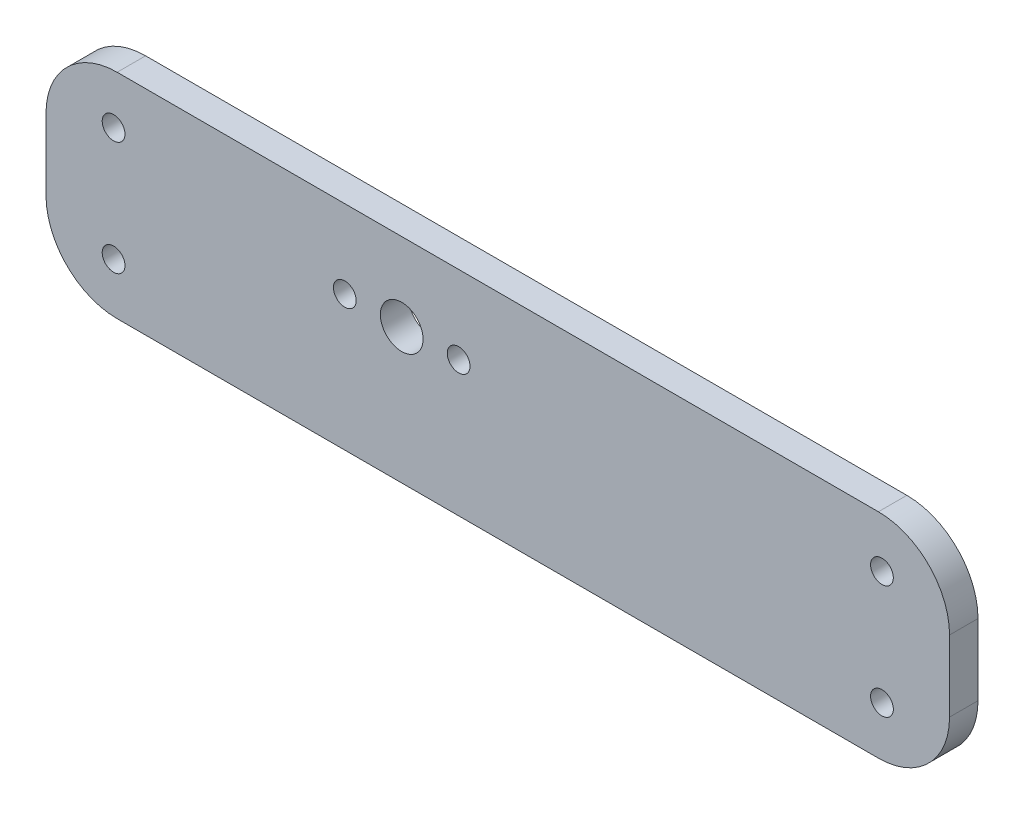
ISO-10303-21;
HEADER;
FILE_DESCRIPTION(('STEP AP214'),'2;1');
FILE_NAME('part.step','',(''),(''),'','','');
FILE_SCHEMA(('AUTOMOTIVE_DESIGN { 1 0 10303 214 1 1 1 1 }'));
ENDSEC;
DATA;
#1=APPLICATION_CONTEXT('core data for automotive mechanical design processes');
#2=APPLICATION_PROTOCOL_DEFINITION('international standard','automotive_design',2000,#1);
#3=PRODUCT_CONTEXT('',#1,'mechanical');
#4=PRODUCT('Part','Part','',(#3));
#5=PRODUCT_RELATED_PRODUCT_CATEGORY('part','',(#4));
#6=PRODUCT_DEFINITION_FORMATION('','',#4);
#7=PRODUCT_DEFINITION_CONTEXT('part definition',#1,'design');
#8=PRODUCT_DEFINITION('design','',#6,#7);
#9=PRODUCT_DEFINITION_SHAPE('','',#8);
#10=(LENGTH_UNIT() NAMED_UNIT(*) SI_UNIT(.MILLI.,.METRE.));
#11=(NAMED_UNIT(*) PLANE_ANGLE_UNIT() SI_UNIT($,.RADIAN.));
#12=(NAMED_UNIT(*) SI_UNIT($,.STERADIAN.) SOLID_ANGLE_UNIT());
#13=UNCERTAINTY_MEASURE_WITH_UNIT(LENGTH_MEASURE(1.E-05),#10,'distance_accuracy_value','');
#14=(GEOMETRIC_REPRESENTATION_CONTEXT(3) GLOBAL_UNCERTAINTY_ASSIGNED_CONTEXT((#13)) GLOBAL_UNIT_ASSIGNED_CONTEXT((#10,
#11,#12)) REPRESENTATION_CONTEXT('',''));
#15=CARTESIAN_POINT('',(0.,0.,0.));
#16=DIRECTION('',(0.,0.,1.));
#17=DIRECTION('',(1.,0.,0.));
#18=AXIS2_PLACEMENT_3D('',#15,#16,#17);
#19=CARTESIAN_POINT('',(0.,0.,4.));
#20=DIRECTION('',(0.,0.,-1.));
#21=DIRECTION('',(-1.,0.,0.));
#22=AXIS2_PLACEMENT_3D('',#19,#20,#21);
#23=PLANE('',#22);
#24=DIRECTION('',(-1.,0.,0.));
#25=VECTOR('',#24,1.);
#26=CARTESIAN_POINT('',(-63.5,15.,4.));
#27=LINE('',#26,#25);
#28=CARTESIAN_POINT('',(53.5,15.,4.));
#29=VERTEX_POINT('',#28);
#30=CARTESIAN_POINT('',(-53.5,15.,4.));
#31=VERTEX_POINT('',#30);
#32=EDGE_CURVE('E172',#29,#31,#27,.T.);
#33=ORIENTED_EDGE('',*,*,#32,.T.);
#34=CARTESIAN_POINT('',(-53.5,5.00000000000002,4.));
#35=DIRECTION('',(0.,0.,-1.));
#36=DIRECTION('',(-1.,0.,0.));
#37=AXIS2_PLACEMENT_3D('',#34,#35,#36);
#38=CIRCLE('',#37,10.);
#39=CARTESIAN_POINT('',(-63.5,5.00000000000002,4.));
#40=VERTEX_POINT('',#39);
#41=EDGE_CURVE('E153',#31,#40,#38,.F.);
#42=ORIENTED_EDGE('',*,*,#41,.T.);
#43=DIRECTION('',(0.,-1.,0.));
#44=VECTOR('',#43,1.);
#45=CARTESIAN_POINT('',(-63.5,-14.9999999999999,4.));
#46=LINE('',#45,#44);
#47=CARTESIAN_POINT('',(-63.5,-4.99999999999994,4.));
#48=VERTEX_POINT('',#47);
#49=EDGE_CURVE('E123',#40,#48,#46,.T.);
#50=ORIENTED_EDGE('',*,*,#49,.T.);
#51=CARTESIAN_POINT('',(-53.5,-4.99999999999994,4.));
#52=DIRECTION('',(0.,0.,-1.));
#53=DIRECTION('',(-1.,0.,0.));
#54=AXIS2_PLACEMENT_3D('',#51,#52,#53);
#55=CIRCLE('',#54,10.);
#56=CARTESIAN_POINT('',(-53.5,-14.9999999999999,4.));
#57=VERTEX_POINT('',#56);
#58=EDGE_CURVE('E59',#48,#57,#55,.F.);
#59=ORIENTED_EDGE('',*,*,#58,.T.);
#60=DIRECTION('',(1.,0.,0.));
#61=VECTOR('',#60,1.);
#62=CARTESIAN_POINT('',(-63.5,-14.9999999999999,4.));
#63=LINE('',#62,#61);
#64=CARTESIAN_POINT('',(53.5,-15.,4.));
#65=VERTEX_POINT('',#64);
#66=EDGE_CURVE('E139',#57,#65,#63,.T.);
#67=ORIENTED_EDGE('',*,*,#66,.T.);
#68=CARTESIAN_POINT('',(53.5,-4.99999999999999,4.));
#69=DIRECTION('',(0.,0.,-1.));
#70=DIRECTION('',(-1.,0.,0.));
#71=AXIS2_PLACEMENT_3D('',#68,#69,#70);
#72=CIRCLE('',#71,10.);
#73=CARTESIAN_POINT('',(63.5,-4.99999999999999,4.));
#74=VERTEX_POINT('',#73);
#75=EDGE_CURVE('E150',#65,#74,#72,.F.);
#76=ORIENTED_EDGE('',*,*,#75,.T.);
#77=DIRECTION('',(0.,1.,0.));
#78=VECTOR('',#77,1.);
#79=CARTESIAN_POINT('',(63.5,-15.,4.));
#80=LINE('',#79,#78);
#81=CARTESIAN_POINT('',(63.5,5.00000000000001,4.));
#82=VERTEX_POINT('',#81);
#83=EDGE_CURVE('E133',#74,#82,#80,.T.);
#84=ORIENTED_EDGE('',*,*,#83,.T.);
#85=CARTESIAN_POINT('',(53.5,5.00000000000001,4.));
#86=DIRECTION('',(0.,0.,-1.));
#87=DIRECTION('',(-1.,0.,0.));
#88=AXIS2_PLACEMENT_3D('',#85,#86,#87);
#89=CIRCLE('',#88,10.);
#90=EDGE_CURVE('E148',#82,#29,#89,.F.);
#91=ORIENTED_EDGE('',*,*,#90,.T.);
#92=EDGE_LOOP('',(#33,#42,#50,#59,#67,#76,#84,#91));
#93=FACE_BOUND('',#92,.T.);
#94=CARTESIAN_POINT('',(-13.5,4.,4.));
#95=DIRECTION('',(0.,0.,1.));
#96=DIRECTION('',(1.,0.,0.));
#97=AXIS2_PLACEMENT_3D('',#94,#95,#96);
#98=CIRCLE('',#97,3.);
#99=CARTESIAN_POINT('',(-10.5,4.,4.));
#100=VERTEX_POINT('',#99);
#101=EDGE_CURVE('E177',#100,#100,#98,.T.);
#102=ORIENTED_EDGE('',*,*,#101,.F.);
#103=EDGE_LOOP('',(#102));
#104=FACE_BOUND('',#103,.T.);
#105=CARTESIAN_POINT('',(-5.49999999999999,4.,4.));
#106=DIRECTION('',(0.,0.,1.));
#107=DIRECTION('',(1.,0.,0.));
#108=AXIS2_PLACEMENT_3D('',#105,#106,#107);
#109=CIRCLE('',#108,1.6);
#110=CARTESIAN_POINT('',(-3.89999999999999,4.,4.));
#111=VERTEX_POINT('',#110);
#112=EDGE_CURVE('E186',#111,#111,#109,.T.);
#113=ORIENTED_EDGE('',*,*,#112,.F.);
#114=EDGE_LOOP('',(#113));
#115=FACE_BOUND('',#114,.T.);
#116=CARTESIAN_POINT('',(-21.5,4.,4.));
#117=DIRECTION('',(0.,0.,1.));
#118=DIRECTION('',(1.,0.,0.));
#119=AXIS2_PLACEMENT_3D('',#116,#117,#118);
#120=CIRCLE('',#119,1.6);
#121=CARTESIAN_POINT('',(-19.9,4.,4.));
#122=VERTEX_POINT('',#121);
#123=EDGE_CURVE('E191',#122,#122,#120,.T.);
#124=ORIENTED_EDGE('',*,*,#123,.F.);
#125=EDGE_LOOP('',(#124));
#126=FACE_BOUND('',#125,.T.);
#127=CARTESIAN_POINT('',(-54.,-8.,4.));
#128=DIRECTION('',(0.,0.,1.));
#129=DIRECTION('',(-1.,0.,0.));
#130=AXIS2_PLACEMENT_3D('',#127,#128,#129);
#131=CIRCLE('',#130,1.6);
#132=CARTESIAN_POINT('',(-55.6,-8.,4.));
#133=VERTEX_POINT('',#132);
#134=EDGE_CURVE('E197',#133,#133,#131,.T.);
#135=ORIENTED_EDGE('',*,*,#134,.F.);
#136=EDGE_LOOP('',(#135));
#137=FACE_BOUND('',#136,.T.);
#138=CARTESIAN_POINT('',(-54.,8.,4.));
#139=DIRECTION('',(0.,0.,1.));
#140=DIRECTION('',(1.,0.,0.));
#141=AXIS2_PLACEMENT_3D('',#138,#139,#140);
#142=CIRCLE('',#141,1.6);
#143=CARTESIAN_POINT('',(-52.4,8.,4.));
#144=VERTEX_POINT('',#143);
#145=EDGE_CURVE('E203',#144,#144,#142,.T.);
#146=ORIENTED_EDGE('',*,*,#145,.F.);
#147=EDGE_LOOP('',(#146));
#148=FACE_BOUND('',#147,.T.);
#149=CARTESIAN_POINT('',(54.,-7.99999999999999,4.));
#150=DIRECTION('',(0.,0.,1.));
#151=DIRECTION('',(1.,0.,0.));
#152=AXIS2_PLACEMENT_3D('',#149,#150,#151);
#153=CIRCLE('',#152,1.6);
#154=CARTESIAN_POINT('',(55.6,-7.99999999999999,4.));
#155=VERTEX_POINT('',#154);
#156=EDGE_CURVE('E209',#155,#155,#153,.T.);
#157=ORIENTED_EDGE('',*,*,#156,.F.);
#158=EDGE_LOOP('',(#157));
#159=FACE_BOUND('',#158,.T.);
#160=CARTESIAN_POINT('',(54.,8.00000000000001,4.));
#161=DIRECTION('',(0.,0.,1.));
#162=DIRECTION('',(-1.,0.,0.));
#163=AXIS2_PLACEMENT_3D('',#160,#161,#162);
#164=CIRCLE('',#163,1.6);
#165=CARTESIAN_POINT('',(52.4,8.00000000000001,4.));
#166=VERTEX_POINT('',#165);
#167=EDGE_CURVE('E215',#166,#166,#164,.T.);
#168=ORIENTED_EDGE('',*,*,#167,.F.);
#169=EDGE_LOOP('',(#168));
#170=FACE_BOUND('',#169,.T.);
#171=ADVANCED_FACE('F37',(#93,#104,#115,#126,#137,#148,#159,#170),#23,.F.);
#172=CARTESIAN_POINT('',(0.,0.,0.));
#173=DIRECTION('',(0.,0.,-1.));
#174=DIRECTION('',(-1.,0.,0.));
#175=AXIS2_PLACEMENT_3D('',#172,#173,#174);
#176=PLANE('',#175);
#177=CARTESIAN_POINT('',(54.,-7.99999999999999,0.));
#178=DIRECTION('',(0.,0.,1.));
#179=DIRECTION('',(1.,0.,0.));
#180=AXIS2_PLACEMENT_3D('',#177,#178,#179);
#181=CIRCLE('',#180,1.6);
#182=CARTESIAN_POINT('',(55.6,-7.99999999999999,0.));
#183=VERTEX_POINT('',#182);
#184=EDGE_CURVE('E212',#183,#183,#181,.T.);
#185=ORIENTED_EDGE('',*,*,#184,.T.);
#186=EDGE_LOOP('',(#185));
#187=FACE_BOUND('',#186,.T.);
#188=CARTESIAN_POINT('',(-54.,-8.,0.));
#189=DIRECTION('',(0.,0.,1.));
#190=DIRECTION('',(-1.,0.,0.));
#191=AXIS2_PLACEMENT_3D('',#188,#189,#190);
#192=CIRCLE('',#191,1.6);
#193=CARTESIAN_POINT('',(-55.6,-8.,0.));
#194=VERTEX_POINT('',#193);
#195=EDGE_CURVE('E200',#194,#194,#192,.T.);
#196=ORIENTED_EDGE('',*,*,#195,.T.);
#197=EDGE_LOOP('',(#196));
#198=FACE_BOUND('',#197,.T.);
#199=CARTESIAN_POINT('',(-5.49999999999999,4.,0.));
#200=DIRECTION('',(0.,0.,1.));
#201=DIRECTION('',(1.,0.,0.));
#202=AXIS2_PLACEMENT_3D('',#199,#200,#201);
#203=CIRCLE('',#202,1.6);
#204=CARTESIAN_POINT('',(-3.89999999999999,4.,0.));
#205=VERTEX_POINT('',#204);
#206=EDGE_CURVE('E188',#205,#205,#203,.T.);
#207=ORIENTED_EDGE('',*,*,#206,.T.);
#208=EDGE_LOOP('',(#207));
#209=FACE_BOUND('',#208,.T.);
#210=DIRECTION('',(0.,-1.,0.));
#211=VECTOR('',#210,1.);
#212=CARTESIAN_POINT('',(-63.5,-14.9999999999999,0.));
#213=LINE('',#212,#211);
#214=CARTESIAN_POINT('',(-63.5,5.00000000000002,0.));
#215=VERTEX_POINT('',#214);
#216=CARTESIAN_POINT('',(-63.5,-4.99999999999994,0.));
#217=VERTEX_POINT('',#216);
#218=EDGE_CURVE('E121',#215,#217,#213,.T.);
#219=ORIENTED_EDGE('',*,*,#218,.F.);
#220=CARTESIAN_POINT('',(-53.5,5.00000000000002,0.));
#221=DIRECTION('',(0.,0.,-1.));
#222=DIRECTION('',(-1.,0.,0.));
#223=AXIS2_PLACEMENT_3D('',#220,#221,#222);
#224=CIRCLE('',#223,10.);
#225=CARTESIAN_POINT('',(-53.5,15.,0.));
#226=VERTEX_POINT('',#225);
#227=EDGE_CURVE('E104',#215,#226,#224,.T.);
#228=ORIENTED_EDGE('',*,*,#227,.T.);
#229=DIRECTION('',(-1.,0.,0.));
#230=VECTOR('',#229,1.);
#231=CARTESIAN_POINT('',(-63.5,15.,0.));
#232=LINE('',#231,#230);
#233=CARTESIAN_POINT('',(53.5,15.,0.));
#234=VERTEX_POINT('',#233);
#235=EDGE_CURVE('E131',#234,#226,#232,.T.);
#236=ORIENTED_EDGE('',*,*,#235,.F.);
#237=CARTESIAN_POINT('',(53.5,5.00000000000001,0.));
#238=DIRECTION('',(0.,0.,-1.));
#239=DIRECTION('',(-1.,0.,0.));
#240=AXIS2_PLACEMENT_3D('',#237,#238,#239);
#241=CIRCLE('',#240,10.);
#242=CARTESIAN_POINT('',(63.5,5.00000000000001,0.));
#243=VERTEX_POINT('',#242);
#244=EDGE_CURVE('E124',#234,#243,#241,.T.);
#245=ORIENTED_EDGE('',*,*,#244,.T.);
#246=DIRECTION('',(0.,1.,0.));
#247=VECTOR('',#246,1.);
#248=CARTESIAN_POINT('',(63.5,-15.,0.));
#249=LINE('',#248,#247);
#250=CARTESIAN_POINT('',(63.5,-4.99999999999999,0.));
#251=VERTEX_POINT('',#250);
#252=EDGE_CURVE('E135',#251,#243,#249,.T.);
#253=ORIENTED_EDGE('',*,*,#252,.F.);
#254=CARTESIAN_POINT('',(53.5,-4.99999999999999,0.));
#255=DIRECTION('',(0.,0.,-1.));
#256=DIRECTION('',(-1.,0.,0.));
#257=AXIS2_PLACEMENT_3D('',#254,#255,#256);
#258=CIRCLE('',#257,10.);
#259=CARTESIAN_POINT('',(53.5,-15.,0.));
#260=VERTEX_POINT('',#259);
#261=EDGE_CURVE('E142',#251,#260,#258,.T.);
#262=ORIENTED_EDGE('',*,*,#261,.T.);
#263=DIRECTION('',(1.,0.,0.));
#264=VECTOR('',#263,1.);
#265=CARTESIAN_POINT('',(-63.5,-14.9999999999999,0.));
#266=LINE('',#265,#264);
#267=CARTESIAN_POINT('',(-53.5,-14.9999999999999,0.));
#268=VERTEX_POINT('',#267);
#269=EDGE_CURVE('E130',#268,#260,#266,.T.);
#270=ORIENTED_EDGE('',*,*,#269,.F.);
#271=CARTESIAN_POINT('',(-53.5,-4.99999999999994,0.));
#272=DIRECTION('',(0.,0.,-1.));
#273=DIRECTION('',(-1.,0.,0.));
#274=AXIS2_PLACEMENT_3D('',#271,#272,#273);
#275=CIRCLE('',#274,10.);
#276=EDGE_CURVE('E115',#268,#217,#275,.T.);
#277=ORIENTED_EDGE('',*,*,#276,.T.);
#278=EDGE_LOOP('',(#219,#228,#236,#245,#253,#262,#270,#277));
#279=FACE_BOUND('',#278,.T.);
#280=CARTESIAN_POINT('',(-13.5,4.,0.));
#281=DIRECTION('',(0.,0.,1.));
#282=DIRECTION('',(1.,0.,0.));
#283=AXIS2_PLACEMENT_3D('',#280,#281,#282);
#284=CIRCLE('',#283,3.);
#285=CARTESIAN_POINT('',(-10.5,4.,0.));
#286=VERTEX_POINT('',#285);
#287=EDGE_CURVE('E179',#286,#286,#284,.T.);
#288=ORIENTED_EDGE('',*,*,#287,.T.);
#289=EDGE_LOOP('',(#288));
#290=FACE_BOUND('',#289,.T.);
#291=CARTESIAN_POINT('',(-21.5,4.,0.));
#292=DIRECTION('',(0.,0.,1.));
#293=DIRECTION('',(1.,0.,0.));
#294=AXIS2_PLACEMENT_3D('',#291,#292,#293);
#295=CIRCLE('',#294,1.6);
#296=CARTESIAN_POINT('',(-19.9,4.,0.));
#297=VERTEX_POINT('',#296);
#298=EDGE_CURVE('E194',#297,#297,#295,.T.);
#299=ORIENTED_EDGE('',*,*,#298,.T.);
#300=EDGE_LOOP('',(#299));
#301=FACE_BOUND('',#300,.T.);
#302=CARTESIAN_POINT('',(-54.,8.,0.));
#303=DIRECTION('',(0.,0.,1.));
#304=DIRECTION('',(1.,0.,0.));
#305=AXIS2_PLACEMENT_3D('',#302,#303,#304);
#306=CIRCLE('',#305,1.6);
#307=CARTESIAN_POINT('',(-52.4,8.,0.));
#308=VERTEX_POINT('',#307);
#309=EDGE_CURVE('E206',#308,#308,#306,.T.);
#310=ORIENTED_EDGE('',*,*,#309,.T.);
#311=EDGE_LOOP('',(#310));
#312=FACE_BOUND('',#311,.T.);
#313=CARTESIAN_POINT('',(54.,8.00000000000001,0.));
#314=DIRECTION('',(0.,0.,1.));
#315=DIRECTION('',(-1.,0.,0.));
#316=AXIS2_PLACEMENT_3D('',#313,#314,#315);
#317=CIRCLE('',#316,1.6);
#318=CARTESIAN_POINT('',(52.4,8.00000000000001,0.));
#319=VERTEX_POINT('',#318);
#320=EDGE_CURVE('E218',#319,#319,#317,.T.);
#321=ORIENTED_EDGE('',*,*,#320,.T.);
#322=EDGE_LOOP('',(#321));
#323=FACE_BOUND('',#322,.T.);
#324=ADVANCED_FACE('F127',(#187,#198,#209,#279,#290,#301,#312,#323),#176,.T.);
#325=CARTESIAN_POINT('',(63.5,-15.,4.));
#326=DIRECTION('',(-1.,0.,0.));
#327=DIRECTION('',(0.,-1.,0.));
#328=AXIS2_PLACEMENT_3D('',#325,#326,#327);
#329=PLANE('',#328);
#330=ORIENTED_EDGE('',*,*,#83,.F.);
#331=DIRECTION('',(0.,0.,-1.));
#332=VECTOR('',#331,1.);
#333=CARTESIAN_POINT('',(63.5,-4.99999999999999,4.));
#334=LINE('',#333,#332);
#335=EDGE_CURVE('E11',#74,#251,#334,.T.);
#336=ORIENTED_EDGE('',*,*,#335,.T.);
#337=ORIENTED_EDGE('',*,*,#252,.T.);
#338=DIRECTION('',(0.,0.,-1.));
#339=VECTOR('',#338,1.);
#340=CARTESIAN_POINT('',(63.5,5.00000000000001,4.));
#341=LINE('',#340,#339);
#342=EDGE_CURVE('E45',#243,#82,#341,.F.);
#343=ORIENTED_EDGE('',*,*,#342,.T.);
#344=EDGE_LOOP('',(#330,#336,#337,#343));
#345=FACE_BOUND('',#344,.T.);
#346=ADVANCED_FACE('F163',(#345),#329,.F.);
#347=CARTESIAN_POINT('',(-63.5,15.,4.));
#348=DIRECTION('',(0.,-1.,0.));
#349=DIRECTION('',(1.,0.,0.));
#350=AXIS2_PLACEMENT_3D('',#347,#348,#349);
#351=PLANE('',#350);
#352=ORIENTED_EDGE('',*,*,#235,.T.);
#353=DIRECTION('',(0.,0.,-1.));
#354=VECTOR('',#353,1.);
#355=CARTESIAN_POINT('',(-53.5,15.,4.));
#356=LINE('',#355,#354);
#357=EDGE_CURVE('E109',#226,#31,#356,.F.);
#358=ORIENTED_EDGE('',*,*,#357,.T.);
#359=ORIENTED_EDGE('',*,*,#32,.F.);
#360=DIRECTION('',(0.,0.,-1.));
#361=VECTOR('',#360,1.);
#362=CARTESIAN_POINT('',(53.5,15.,4.));
#363=LINE('',#362,#361);
#364=EDGE_CURVE('E114',#29,#234,#363,.T.);
#365=ORIENTED_EDGE('',*,*,#364,.T.);
#366=EDGE_LOOP('',(#352,#358,#359,#365));
#367=FACE_BOUND('',#366,.T.);
#368=ADVANCED_FACE('F176',(#367),#351,.F.);
#369=CARTESIAN_POINT('',(-63.5,-14.9999999999999,4.));
#370=DIRECTION('',(1.,0.,0.));
#371=DIRECTION('',(0.,0.,-1.));
#372=AXIS2_PLACEMENT_3D('',#369,#370,#371);
#373=PLANE('',#372);
#374=ORIENTED_EDGE('',*,*,#49,.F.);
#375=DIRECTION('',(0.,0.,-1.));
#376=VECTOR('',#375,1.);
#377=CARTESIAN_POINT('',(-63.5,5.00000000000002,4.));
#378=LINE('',#377,#376);
#379=EDGE_CURVE('E108',#40,#215,#378,.T.);
#380=ORIENTED_EDGE('',*,*,#379,.T.);
#381=ORIENTED_EDGE('',*,*,#218,.T.);
#382=DIRECTION('',(0.,0.,-1.));
#383=VECTOR('',#382,1.);
#384=CARTESIAN_POINT('',(-63.5,-4.99999999999994,4.));
#385=LINE('',#384,#383);
#386=EDGE_CURVE('E125',#217,#48,#385,.F.);
#387=ORIENTED_EDGE('',*,*,#386,.T.);
#388=EDGE_LOOP('',(#374,#380,#381,#387));
#389=FACE_BOUND('',#388,.T.);
#390=ADVANCED_FACE('F120',(#389),#373,.F.);
#391=CARTESIAN_POINT('',(-63.5,-14.9999999999999,4.));
#392=DIRECTION('',(0.,1.,0.));
#393=DIRECTION('',(-1.,0.,0.));
#394=AXIS2_PLACEMENT_3D('',#391,#392,#393);
#395=PLANE('',#394);
#396=ORIENTED_EDGE('',*,*,#66,.F.);
#397=DIRECTION('',(0.,0.,-1.));
#398=VECTOR('',#397,1.);
#399=CARTESIAN_POINT('',(-53.5,-14.9999999999999,4.));
#400=LINE('',#399,#398);
#401=EDGE_CURVE('E156',#57,#268,#400,.T.);
#402=ORIENTED_EDGE('',*,*,#401,.T.);
#403=ORIENTED_EDGE('',*,*,#269,.T.);
#404=DIRECTION('',(0.,0.,-1.));
#405=VECTOR('',#404,1.);
#406=CARTESIAN_POINT('',(53.5,-15.,4.));
#407=LINE('',#406,#405);
#408=EDGE_CURVE('E52',#260,#65,#407,.F.);
#409=ORIENTED_EDGE('',*,*,#408,.T.);
#410=EDGE_LOOP('',(#396,#402,#403,#409));
#411=FACE_BOUND('',#410,.T.);
#412=ADVANCED_FACE('F238',(#411),#395,.F.);
#413=CARTESIAN_POINT('',(-13.5,4.,4.));
#414=DIRECTION('',(0.,0.,-1.));
#415=DIRECTION('',(-1.,0.,0.));
#416=AXIS2_PLACEMENT_3D('',#413,#414,#415);
#417=CYLINDRICAL_SURFACE('',#416,3.);
#418=ORIENTED_EDGE('',*,*,#101,.T.);
#419=EDGE_LOOP('',(#418));
#420=FACE_BOUND('',#419,.T.);
#421=ORIENTED_EDGE('',*,*,#287,.F.);
#422=EDGE_LOOP('',(#421));
#423=FACE_BOUND('',#422,.T.);
#424=ADVANCED_FACE('F235',(#420,#423),#417,.F.);
#425=CARTESIAN_POINT('',(-5.49999999999999,4.,4.));
#426=DIRECTION('',(0.,0.,-1.));
#427=DIRECTION('',(-1.,0.,0.));
#428=AXIS2_PLACEMENT_3D('',#425,#426,#427);
#429=CYLINDRICAL_SURFACE('',#428,1.6);
#430=ORIENTED_EDGE('',*,*,#112,.T.);
#431=EDGE_LOOP('',(#430));
#432=FACE_BOUND('',#431,.T.);
#433=ORIENTED_EDGE('',*,*,#206,.F.);
#434=EDGE_LOOP('',(#433));
#435=FACE_BOUND('',#434,.T.);
#436=ADVANCED_FACE('F360',(#432,#435),#429,.F.);
#437=CARTESIAN_POINT('',(-21.5,4.,4.));
#438=DIRECTION('',(0.,0.,-1.));
#439=DIRECTION('',(-1.,0.,0.));
#440=AXIS2_PLACEMENT_3D('',#437,#438,#439);
#441=CYLINDRICAL_SURFACE('',#440,1.6);
#442=ORIENTED_EDGE('',*,*,#123,.T.);
#443=EDGE_LOOP('',(#442));
#444=FACE_BOUND('',#443,.T.);
#445=ORIENTED_EDGE('',*,*,#298,.F.);
#446=EDGE_LOOP('',(#445));
#447=FACE_BOUND('',#446,.T.);
#448=ADVANCED_FACE('F350',(#444,#447),#441,.F.);
#449=CARTESIAN_POINT('',(-54.,-8.,4.));
#450=DIRECTION('',(0.,0.,-1.));
#451=DIRECTION('',(-1.,0.,0.));
#452=AXIS2_PLACEMENT_3D('',#449,#450,#451);
#453=CYLINDRICAL_SURFACE('',#452,1.6);
#454=ORIENTED_EDGE('',*,*,#134,.T.);
#455=EDGE_LOOP('',(#454));
#456=FACE_BOUND('',#455,.T.);
#457=ORIENTED_EDGE('',*,*,#195,.F.);
#458=EDGE_LOOP('',(#457));
#459=FACE_BOUND('',#458,.T.);
#460=ADVANCED_FACE('F340',(#456,#459),#453,.F.);
#461=CARTESIAN_POINT('',(-54.,8.,4.));
#462=DIRECTION('',(0.,0.,-1.));
#463=DIRECTION('',(-1.,0.,0.));
#464=AXIS2_PLACEMENT_3D('',#461,#462,#463);
#465=CYLINDRICAL_SURFACE('',#464,1.6);
#466=ORIENTED_EDGE('',*,*,#145,.T.);
#467=EDGE_LOOP('',(#466));
#468=FACE_BOUND('',#467,.T.);
#469=ORIENTED_EDGE('',*,*,#309,.F.);
#470=EDGE_LOOP('',(#469));
#471=FACE_BOUND('',#470,.T.);
#472=ADVANCED_FACE('F330',(#468,#471),#465,.F.);
#473=CARTESIAN_POINT('',(54.,-7.99999999999999,4.));
#474=DIRECTION('',(0.,0.,-1.));
#475=DIRECTION('',(-1.,0.,0.));
#476=AXIS2_PLACEMENT_3D('',#473,#474,#475);
#477=CYLINDRICAL_SURFACE('',#476,1.6);
#478=ORIENTED_EDGE('',*,*,#156,.T.);
#479=EDGE_LOOP('',(#478));
#480=FACE_BOUND('',#479,.T.);
#481=ORIENTED_EDGE('',*,*,#184,.F.);
#482=EDGE_LOOP('',(#481));
#483=FACE_BOUND('',#482,.T.);
#484=ADVANCED_FACE('F321',(#480,#483),#477,.F.);
#485=CARTESIAN_POINT('',(54.,8.00000000000001,4.));
#486=DIRECTION('',(0.,0.,-1.));
#487=DIRECTION('',(-1.,0.,0.));
#488=AXIS2_PLACEMENT_3D('',#485,#486,#487);
#489=CYLINDRICAL_SURFACE('',#488,1.6);
#490=ORIENTED_EDGE('',*,*,#167,.T.);
#491=EDGE_LOOP('',(#490));
#492=FACE_BOUND('',#491,.T.);
#493=ORIENTED_EDGE('',*,*,#320,.F.);
#494=EDGE_LOOP('',(#493));
#495=FACE_BOUND('',#494,.T.);
#496=ADVANCED_FACE('F224',(#492,#495),#489,.F.);
#497=CARTESIAN_POINT('',(-53.5,5.00000000000002,4.));
#498=DIRECTION('',(0.,0.,-1.));
#499=DIRECTION('',(-1.,0.,0.));
#500=AXIS2_PLACEMENT_3D('',#497,#498,#499);
#501=CYLINDRICAL_SURFACE('',#500,10.);
#502=ORIENTED_EDGE('',*,*,#41,.F.);
#503=ORIENTED_EDGE('',*,*,#357,.F.);
#504=ORIENTED_EDGE('',*,*,#227,.F.);
#505=ORIENTED_EDGE('',*,*,#379,.F.);
#506=EDGE_LOOP('',(#502,#503,#504,#505));
#507=FACE_BOUND('',#506,.T.);
#508=ADVANCED_FACE('F107',(#507),#501,.T.);
#509=CARTESIAN_POINT('',(-53.5,-4.99999999999994,4.));
#510=DIRECTION('',(0.,0.,-1.));
#511=DIRECTION('',(-1.,0.,0.));
#512=AXIS2_PLACEMENT_3D('',#509,#510,#511);
#513=CYLINDRICAL_SURFACE('',#512,10.);
#514=ORIENTED_EDGE('',*,*,#58,.F.);
#515=ORIENTED_EDGE('',*,*,#386,.F.);
#516=ORIENTED_EDGE('',*,*,#276,.F.);
#517=ORIENTED_EDGE('',*,*,#401,.F.);
#518=EDGE_LOOP('',(#514,#515,#516,#517));
#519=FACE_BOUND('',#518,.T.);
#520=ADVANCED_FACE('F249',(#519),#513,.T.);
#521=CARTESIAN_POINT('',(53.5,-4.99999999999999,4.));
#522=DIRECTION('',(0.,0.,-1.));
#523=DIRECTION('',(-1.,0.,0.));
#524=AXIS2_PLACEMENT_3D('',#521,#522,#523);
#525=CYLINDRICAL_SURFACE('',#524,10.);
#526=ORIENTED_EDGE('',*,*,#75,.F.);
#527=ORIENTED_EDGE('',*,*,#408,.F.);
#528=ORIENTED_EDGE('',*,*,#261,.F.);
#529=ORIENTED_EDGE('',*,*,#335,.F.);
#530=EDGE_LOOP('',(#526,#527,#528,#529));
#531=FACE_BOUND('',#530,.T.);
#532=ADVANCED_FACE('F251',(#531),#525,.T.);
#533=CARTESIAN_POINT('',(53.5,5.00000000000001,4.));
#534=DIRECTION('',(0.,0.,-1.));
#535=DIRECTION('',(-1.,0.,0.));
#536=AXIS2_PLACEMENT_3D('',#533,#534,#535);
#537=CYLINDRICAL_SURFACE('',#536,10.);
#538=ORIENTED_EDGE('',*,*,#90,.F.);
#539=ORIENTED_EDGE('',*,*,#342,.F.);
#540=ORIENTED_EDGE('',*,*,#244,.F.);
#541=ORIENTED_EDGE('',*,*,#364,.F.);
#542=EDGE_LOOP('',(#538,#539,#540,#541));
#543=FACE_BOUND('',#542,.T.);
#544=ADVANCED_FACE('F39',(#543),#537,.T.);
#545=CLOSED_SHELL('',(#171,#324,#346,#368,#390,#412,#424,#436,#448,#460,#472,#484,#496,#508,
#520,#532,#544));
#546=MANIFOLD_SOLID_BREP('B2',#545);
#547=ADVANCED_BREP_SHAPE_REPRESENTATION('',(#18,#546),#14);
#548=SHAPE_DEFINITION_REPRESENTATION(#9,#547);
ENDSEC;
END-ISO-10303-21;
